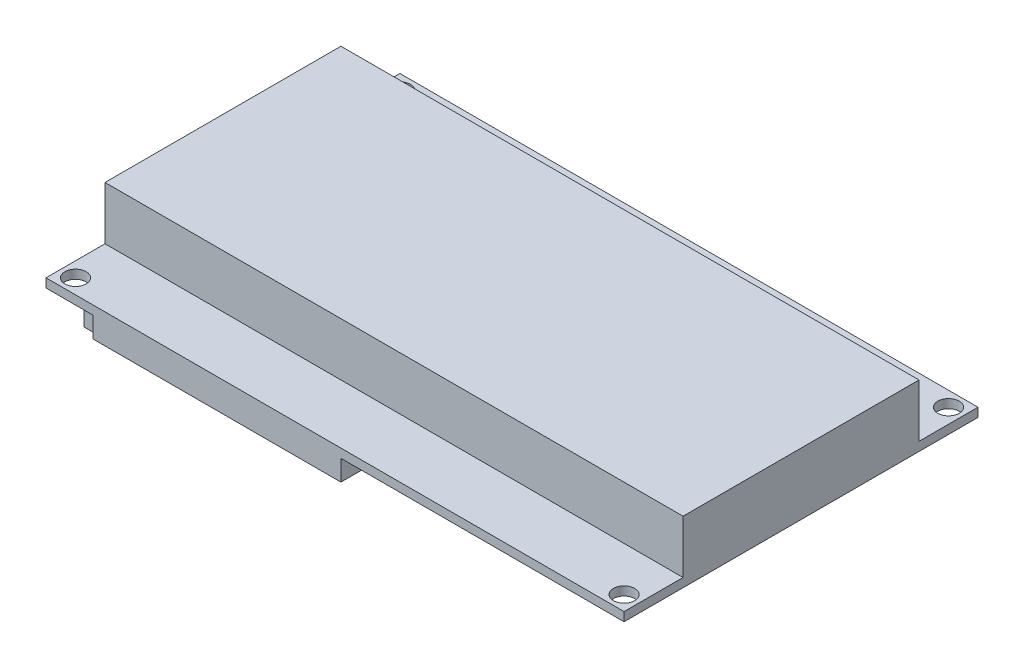
ISO-10303-21;
HEADER;
FILE_DESCRIPTION(('STEP AP214'),'2;1');
FILE_NAME('part.step','',(''),(''),'','','');
FILE_SCHEMA(('AUTOMOTIVE_DESIGN { 1 0 10303 214 1 1 1 1 }'));
ENDSEC;
DATA;
#1=APPLICATION_CONTEXT('core data for automotive mechanical design processes');
#2=APPLICATION_PROTOCOL_DEFINITION('international standard','automotive_design',2000,#1);
#3=PRODUCT_CONTEXT('',#1,'mechanical');
#4=PRODUCT('Part','Part','',(#3));
#5=PRODUCT_RELATED_PRODUCT_CATEGORY('part','',(#4));
#6=PRODUCT_DEFINITION_FORMATION('','',#4);
#7=PRODUCT_DEFINITION_CONTEXT('part definition',#1,'design');
#8=PRODUCT_DEFINITION('design','',#6,#7);
#9=PRODUCT_DEFINITION_SHAPE('','',#8);
#10=(LENGTH_UNIT() NAMED_UNIT(*) SI_UNIT(.MILLI.,.METRE.));
#11=(NAMED_UNIT(*) PLANE_ANGLE_UNIT() SI_UNIT($,.RADIAN.));
#12=(NAMED_UNIT(*) SI_UNIT($,.STERADIAN.) SOLID_ANGLE_UNIT());
#13=UNCERTAINTY_MEASURE_WITH_UNIT(LENGTH_MEASURE(1.E-05),#10,'distance_accuracy_value','');
#14=(GEOMETRIC_REPRESENTATION_CONTEXT(3) GLOBAL_UNCERTAINTY_ASSIGNED_CONTEXT((#13)) GLOBAL_UNIT_ASSIGNED_CONTEXT((#10,
#11,#12)) REPRESENTATION_CONTEXT('',''));
#15=CARTESIAN_POINT('',(0.,0.,0.));
#16=DIRECTION('',(0.,0.,1.));
#17=DIRECTION('',(1.,0.,0.));
#18=AXIS2_PLACEMENT_3D('',#15,#16,#17);
#19=CARTESIAN_POINT('',(0.,-3.5,0.));
#20=DIRECTION('',(0.,-1.,0.));
#21=DIRECTION('',(0.,0.,-1.));
#22=AXIS2_PLACEMENT_3D('',#19,#20,#21);
#23=PLANE('',#22);
#24=DIRECTION('',(1.,0.,0.));
#25=VECTOR('',#24,1.);
#26=CARTESIAN_POINT('',(-31.1622903908173,-3.5,12.3796659761304));
#27=LINE('',#26,#25);
#28=CARTESIAN_POINT('',(-31.1622903908173,-3.5,12.3796659761304));
#29=VERTEX_POINT('',#28);
#30=CARTESIAN_POINT('',(-25.9601784616069,-3.5,12.3796659761304));
#31=VERTEX_POINT('',#30);
#32=EDGE_CURVE('E313',#29,#31,#27,.T.);
#33=ORIENTED_EDGE('',*,*,#32,.F.);
#34=DIRECTION('',(0.,0.,-1.));
#35=VECTOR('',#34,1.);
#36=CARTESIAN_POINT('',(-31.1622903908173,-3.5,17.7206240939256));
#37=LINE('',#36,#35);
#38=CARTESIAN_POINT('',(-31.1622903908173,-3.5,17.7206240939256));
#39=VERTEX_POINT('',#38);
#40=EDGE_CURVE('E297',#39,#29,#37,.T.);
#41=ORIENTED_EDGE('',*,*,#40,.F.);
#42=DIRECTION('',(-1.,0.,0.));
#43=VECTOR('',#42,1.);
#44=CARTESIAN_POINT('',(-31.1622903908173,-3.5,17.7206240939256));
#45=LINE('',#44,#43);
#46=CARTESIAN_POINT('',(-25.9601784616069,-3.5,17.7206240939256));
#47=VERTEX_POINT('',#46);
#48=EDGE_CURVE('E304',#47,#39,#45,.T.);
#49=ORIENTED_EDGE('',*,*,#48,.F.);
#50=DIRECTION('',(0.,0.,1.));
#51=VECTOR('',#50,1.);
#52=CARTESIAN_POINT('',(-25.9601784616069,-3.5,17.7206240939256));
#53=LINE('',#52,#51);
#54=EDGE_CURVE('E317',#31,#47,#53,.T.);
#55=ORIENTED_EDGE('',*,*,#54,.F.);
#56=EDGE_LOOP('',(#33,#41,#49,#55));
#57=FACE_BOUND('',#56,.T.);
#58=DIRECTION('',(-1.,0.,0.));
#59=VECTOR('',#58,1.);
#60=CARTESIAN_POINT('',(-14.9200792291282,-3.5,24.751400220321));
#61=LINE('',#60,#59);
#62=CARTESIAN_POINT('',(-14.9200792291282,-3.5,24.751400220321));
#63=VERTEX_POINT('',#62);
#64=CARTESIAN_POINT('',(-20.8123605335331,-3.5,24.751400220321));
#65=VERTEX_POINT('',#64);
#66=EDGE_CURVE('E266',#63,#65,#61,.T.);
#67=ORIENTED_EDGE('',*,*,#66,.F.);
#68=DIRECTION('',(0.,0.,1.));
#69=VECTOR('',#68,1.);
#70=CARTESIAN_POINT('',(-14.9200792291282,-3.5,14.848599779679));
#71=LINE('',#70,#69);
#72=CARTESIAN_POINT('',(-14.9200792291282,-3.5,14.848599779679));
#73=VERTEX_POINT('',#72);
#74=EDGE_CURVE('E267',#73,#63,#71,.T.);
#75=ORIENTED_EDGE('',*,*,#74,.F.);
#76=DIRECTION('',(1.,0.,0.));
#77=VECTOR('',#76,1.);
#78=CARTESIAN_POINT('',(-14.9200792291282,-3.5,14.848599779679));
#79=LINE('',#78,#77);
#80=CARTESIAN_POINT('',(-20.8123605335331,-3.5,14.848599779679));
#81=VERTEX_POINT('',#80);
#82=EDGE_CURVE('E278',#81,#73,#79,.T.);
#83=ORIENTED_EDGE('',*,*,#82,.F.);
#84=DIRECTION('',(0.,0.,-1.));
#85=VECTOR('',#84,1.);
#86=CARTESIAN_POINT('',(-20.8123605335331,-3.5,14.848599779679));
#87=LINE('',#86,#85);
#88=EDGE_CURVE('E290',#65,#81,#87,.T.);
#89=ORIENTED_EDGE('',*,*,#88,.F.);
#90=EDGE_LOOP('',(#67,#75,#83,#89));
#91=FACE_BOUND('',#90,.T.);
#92=DIRECTION('',(0.,0.,1.));
#93=VECTOR('',#92,1.);
#94=CARTESIAN_POINT('',(1.,-3.5,30.));
#95=LINE('',#94,#93);
#96=CARTESIAN_POINT('',(1.,-3.5,9.59999999999999));
#97=VERTEX_POINT('',#96);
#98=CARTESIAN_POINT('',(1.,-3.5,15.));
#99=VERTEX_POINT('',#98);
#100=EDGE_CURVE('E368',#97,#99,#95,.T.);
#101=ORIENTED_EDGE('',*,*,#100,.T.);
#102=DIRECTION('',(1.,0.,0.));
#103=VECTOR('',#102,1.);
#104=CARTESIAN_POINT('',(-1.5,-3.5,15.));
#105=LINE('',#104,#103);
#106=CARTESIAN_POINT('',(-1.5,-3.5,15.));
#107=VERTEX_POINT('',#106);
#108=EDGE_CURVE('E62',#107,#99,#105,.T.);
#109=ORIENTED_EDGE('',*,*,#108,.F.);
#110=DIRECTION('',(0.,0.,-1.));
#111=VECTOR('',#110,1.);
#112=CARTESIAN_POINT('',(-1.5,-3.5,19.8));
#113=LINE('',#112,#111);
#114=CARTESIAN_POINT('',(-1.5,-3.5,19.8));
#115=VERTEX_POINT('',#114);
#116=EDGE_CURVE('E70',#115,#107,#113,.T.);
#117=ORIENTED_EDGE('',*,*,#116,.F.);
#118=DIRECTION('',(-1.,0.,0.));
#119=VECTOR('',#118,1.);
#120=CARTESIAN_POINT('',(-1.5,-3.5,19.8));
#121=LINE('',#120,#119);
#122=CARTESIAN_POINT('',(1.,-3.5,19.8));
#123=VERTEX_POINT('',#122);
#124=EDGE_CURVE('E527',#123,#115,#121,.T.);
#125=ORIENTED_EDGE('',*,*,#124,.F.);
#126=CARTESIAN_POINT('',(1.,-3.5,30.));
#127=VERTEX_POINT('',#126);
#128=EDGE_CURVE('E370',#123,#127,#95,.T.);
#129=ORIENTED_EDGE('',*,*,#128,.T.);
#130=DIRECTION('',(-1.,0.,0.));
#131=VECTOR('',#130,1.);
#132=CARTESIAN_POINT('',(-41.,-3.5,30.));
#133=LINE('',#132,#131);
#134=CARTESIAN_POINT('',(-41.,-3.5,30.));
#135=VERTEX_POINT('',#134);
#136=EDGE_CURVE('E369',#127,#135,#133,.T.);
#137=ORIENTED_EDGE('',*,*,#136,.T.);
#138=DIRECTION('',(0.,0.,-1.));
#139=VECTOR('',#138,1.);
#140=CARTESIAN_POINT('',(-41.,-3.5,30.));
#141=LINE('',#140,#139);
#142=CARTESIAN_POINT('',(-41.,-3.5,24.8));
#143=VERTEX_POINT('',#142);
#144=EDGE_CURVE('E363',#135,#143,#141,.T.);
#145=ORIENTED_EDGE('',*,*,#144,.T.);
#146=DIRECTION('',(-1.,0.,0.));
#147=VECTOR('',#146,1.);
#148=CARTESIAN_POINT('',(-38.5,-3.5,24.8));
#149=LINE('',#148,#147);
#150=CARTESIAN_POINT('',(-38.5,-3.5,24.8));
#151=VERTEX_POINT('',#150);
#152=EDGE_CURVE('E344',#151,#143,#149,.T.);
#153=ORIENTED_EDGE('',*,*,#152,.F.);
#154=DIRECTION('',(0.,0.,1.));
#155=VECTOR('',#154,1.);
#156=CARTESIAN_POINT('',(-38.5,-3.5,24.8));
#157=LINE('',#156,#155);
#158=CARTESIAN_POINT('',(-38.5,-3.5,14.8));
#159=VERTEX_POINT('',#158);
#160=EDGE_CURVE('E326',#159,#151,#157,.T.);
#161=ORIENTED_EDGE('',*,*,#160,.F.);
#162=DIRECTION('',(1.,0.,0.));
#163=VECTOR('',#162,1.);
#164=CARTESIAN_POINT('',(-38.5,-3.5,14.8));
#165=LINE('',#164,#163);
#166=CARTESIAN_POINT('',(-41.,-3.5,14.8));
#167=VERTEX_POINT('',#166);
#168=EDGE_CURVE('E11',#167,#159,#165,.T.);
#169=ORIENTED_EDGE('',*,*,#168,.F.);
#170=CARTESIAN_POINT('',(-41.,-3.5,9.59999999999999));
#171=VERTEX_POINT('',#170);
#172=EDGE_CURVE('E362',#167,#171,#141,.T.);
#173=ORIENTED_EDGE('',*,*,#172,.T.);
#174=DIRECTION('',(1.,0.,0.));
#175=VECTOR('',#174,1.);
#176=CARTESIAN_POINT('',(-41.,-3.5,9.59999999999999));
#177=LINE('',#176,#175);
#178=EDGE_CURVE('E361',#171,#97,#177,.T.);
#179=ORIENTED_EDGE('',*,*,#178,.T.);
#180=EDGE_LOOP('',(#101,#109,#117,#125,#129,#137,#145,#153,#161,#169,#173,#179));
#181=FACE_BOUND('',#180,.T.);
#182=ADVANCED_FACE('F44',(#57,#91,#181),#23,.T.);
#183=CARTESIAN_POINT('',(0.,1.5,0.));
#184=DIRECTION('',(0.,-1.,0.));
#185=DIRECTION('',(0.,0.,-1.));
#186=AXIS2_PLACEMENT_3D('',#183,#184,#185);
#187=PLANE('',#186);
#188=CARTESIAN_POINT('',(-46.5,1.5,27.5));
#189=DIRECTION('',(0.,-1.,0.));
#190=DIRECTION('',(0.,0.,-1.));
#191=AXIS2_PLACEMENT_3D('',#188,#189,#190);
#192=CIRCLE('',#191,1.8);
#193=CARTESIAN_POINT('',(-46.5,1.5,25.7));
#194=VERTEX_POINT('',#193);
#195=EDGE_CURVE('E460',#194,#194,#192,.T.);
#196=ORIENTED_EDGE('',*,*,#195,.T.);
#197=EDGE_LOOP('',(#196));
#198=FACE_BOUND('',#197,.T.);
#199=DIRECTION('',(1.,0.,0.));
#200=VECTOR('',#199,1.);
#201=CARTESIAN_POINT('',(0.,1.5,20.));
#202=LINE('',#201,#200);
#203=CARTESIAN_POINT('',(-49.,1.5,20.));
#204=VERTEX_POINT('',#203);
#205=CARTESIAN_POINT('',(49.,1.5,20.));
#206=VERTEX_POINT('',#205);
#207=EDGE_CURVE('E458',#204,#206,#202,.T.);
#208=ORIENTED_EDGE('',*,*,#207,.F.);
#209=DIRECTION('',(0.,0.,1.));
#210=VECTOR('',#209,1.);
#211=CARTESIAN_POINT('',(-49.,1.5,0.));
#212=LINE('',#211,#210);
#213=CARTESIAN_POINT('',(-49.,1.5,30.));
#214=VERTEX_POINT('',#213);
#215=EDGE_CURVE('E468',#204,#214,#212,.T.);
#216=ORIENTED_EDGE('',*,*,#215,.T.);
#217=DIRECTION('',(1.,0.,0.));
#218=VECTOR('',#217,1.);
#219=CARTESIAN_POINT('',(0.,1.5,30.));
#220=LINE('',#219,#218);
#221=CARTESIAN_POINT('',(49.,1.5,30.));
#222=VERTEX_POINT('',#221);
#223=EDGE_CURVE('E472',#214,#222,#220,.T.);
#224=ORIENTED_EDGE('',*,*,#223,.T.);
#225=DIRECTION('',(0.,0.,1.));
#226=VECTOR('',#225,1.);
#227=CARTESIAN_POINT('',(49.,1.5,0.));
#228=LINE('',#227,#226);
#229=EDGE_CURVE('E447',#206,#222,#228,.T.);
#230=ORIENTED_EDGE('',*,*,#229,.F.);
#231=EDGE_LOOP('',(#208,#216,#224,#230));
#232=FACE_BOUND('',#231,.T.);
#233=CARTESIAN_POINT('',(46.5,1.5,27.5));
#234=DIRECTION('',(0.,1.,0.));
#235=DIRECTION('',(0.,0.,-1.));
#236=AXIS2_PLACEMENT_3D('',#233,#234,#235);
#237=CIRCLE('',#236,1.8);
#238=CARTESIAN_POINT('',(46.5,1.5,25.7));
#239=VERTEX_POINT('',#238);
#240=EDGE_CURVE('E436',#239,#239,#237,.T.);
#241=ORIENTED_EDGE('',*,*,#240,.F.);
#242=EDGE_LOOP('',(#241));
#243=FACE_BOUND('',#242,.T.);
#244=ADVANCED_FACE('F517',(#198,#232,#243),#187,.F.);
#245=CARTESIAN_POINT('',(-49.,1.5,0.));
#246=DIRECTION('',(1.,0.,0.));
#247=DIRECTION('',(0.,0.,-1.));
#248=AXIS2_PLACEMENT_3D('',#245,#246,#247);
#249=PLANE('',#248);
#250=DIRECTION('',(0.,0.,1.));
#251=VECTOR('',#250,1.);
#252=CARTESIAN_POINT('',(-49.,0.,0.));
#253=LINE('',#252,#251);
#254=CARTESIAN_POINT('',(-49.,0.,-30.));
#255=VERTEX_POINT('',#254);
#256=CARTESIAN_POINT('',(-49.,0.,30.));
#257=VERTEX_POINT('',#256);
#258=EDGE_CURVE('E469',#255,#257,#253,.T.);
#259=ORIENTED_EDGE('',*,*,#258,.T.);
#260=DIRECTION('',(0.,-1.,0.));
#261=VECTOR('',#260,1.);
#262=CARTESIAN_POINT('',(-49.,1.5,30.));
#263=LINE('',#262,#261);
#264=EDGE_CURVE('E47',#214,#257,#263,.T.);
#265=ORIENTED_EDGE('',*,*,#264,.F.);
#266=ORIENTED_EDGE('',*,*,#215,.F.);
#267=DIRECTION('',(0.,-1.,0.));
#268=VECTOR('',#267,1.);
#269=CARTESIAN_POINT('',(-49.,10.5,20.));
#270=LINE('',#269,#268);
#271=CARTESIAN_POINT('',(-49.,10.5,20.));
#272=VERTEX_POINT('',#271);
#273=EDGE_CURVE('E463',#272,#204,#270,.T.);
#274=ORIENTED_EDGE('',*,*,#273,.F.);
#275=DIRECTION('',(0.,0.,1.));
#276=VECTOR('',#275,1.);
#277=CARTESIAN_POINT('',(-49.,10.5,0.));
#278=LINE('',#277,#276);
#279=CARTESIAN_POINT('',(-49.,10.5,-20.));
#280=VERTEX_POINT('',#279);
#281=EDGE_CURVE('E462',#280,#272,#278,.T.);
#282=ORIENTED_EDGE('',*,*,#281,.F.);
#283=DIRECTION('',(0.,-1.,0.));
#284=VECTOR('',#283,1.);
#285=CARTESIAN_POINT('',(-49.,10.5,-20.));
#286=LINE('',#285,#284);
#287=CARTESIAN_POINT('',(-49.,1.5,-20.));
#288=VERTEX_POINT('',#287);
#289=EDGE_CURVE('E420',#280,#288,#286,.T.);
#290=ORIENTED_EDGE('',*,*,#289,.T.);
#291=DIRECTION('',(0.,0.,-1.));
#292=VECTOR('',#291,1.);
#293=CARTESIAN_POINT('',(-49.,1.5,0.));
#294=LINE('',#293,#292);
#295=CARTESIAN_POINT('',(-49.,1.5,-30.));
#296=VERTEX_POINT('',#295);
#297=EDGE_CURVE('E422',#288,#296,#294,.T.);
#298=ORIENTED_EDGE('',*,*,#297,.T.);
#299=DIRECTION('',(0.,-1.,0.));
#300=VECTOR('',#299,1.);
#301=CARTESIAN_POINT('',(-49.,1.5,-30.));
#302=LINE('',#301,#300);
#303=EDGE_CURVE('E426',#296,#255,#302,.T.);
#304=ORIENTED_EDGE('',*,*,#303,.T.);
#305=EDGE_LOOP('',(#259,#265,#266,#274,#282,#290,#298,#304));
#306=FACE_BOUND('',#305,.T.);
#307=ADVANCED_FACE('F50',(#306),#249,.F.);
#308=CARTESIAN_POINT('',(0.,1.5,30.));
#309=DIRECTION('',(0.,0.,-1.));
#310=DIRECTION('',(-1.,0.,0.));
#311=AXIS2_PLACEMENT_3D('',#308,#309,#310);
#312=PLANE('',#311);
#313=DIRECTION('',(1.,0.,0.));
#314=VECTOR('',#313,1.);
#315=CARTESIAN_POINT('',(0.,0.,30.));
#316=LINE('',#315,#314);
#317=CARTESIAN_POINT('',(-41.,0.,30.));
#318=VERTEX_POINT('',#317);
#319=EDGE_CURVE('E474',#257,#318,#316,.T.);
#320=ORIENTED_EDGE('',*,*,#319,.T.);
#321=DIRECTION('',(0.,1.,0.));
#322=VECTOR('',#321,1.);
#323=CARTESIAN_POINT('',(-41.,-3.5,30.));
#324=LINE('',#323,#322);
#325=EDGE_CURVE('E373',#135,#318,#324,.T.);
#326=ORIENTED_EDGE('',*,*,#325,.F.);
#327=ORIENTED_EDGE('',*,*,#136,.F.);
#328=DIRECTION('',(0.,1.,0.));
#329=VECTOR('',#328,1.);
#330=CARTESIAN_POINT('',(1.,-3.5,30.));
#331=LINE('',#330,#329);
#332=CARTESIAN_POINT('',(1.,0.,30.));
#333=VERTEX_POINT('',#332);
#334=EDGE_CURVE('E381',#127,#333,#331,.T.);
#335=ORIENTED_EDGE('',*,*,#334,.T.);
#336=CARTESIAN_POINT('',(49.,0.,30.));
#337=VERTEX_POINT('',#336);
#338=EDGE_CURVE('E475',#333,#337,#316,.T.);
#339=ORIENTED_EDGE('',*,*,#338,.T.);
#340=DIRECTION('',(0.,-1.,0.));
#341=VECTOR('',#340,1.);
#342=CARTESIAN_POINT('',(49.,1.5,30.));
#343=LINE('',#342,#341);
#344=EDGE_CURVE('E446',#222,#337,#343,.T.);
#345=ORIENTED_EDGE('',*,*,#344,.F.);
#346=ORIENTED_EDGE('',*,*,#223,.F.);
#347=ORIENTED_EDGE('',*,*,#264,.T.);
#348=EDGE_LOOP('',(#320,#326,#327,#335,#339,#345,#346,#347));
#349=FACE_BOUND('',#348,.T.);
#350=ADVANCED_FACE('F485',(#349),#312,.F.);
#351=CARTESIAN_POINT('',(0.,0.,0.));
#352=DIRECTION('',(0.,-1.,0.));
#353=DIRECTION('',(0.,0.,-1.));
#354=AXIS2_PLACEMENT_3D('',#351,#352,#353);
#355=PLANE('',#354);
#356=DIRECTION('',(0.,0.,-1.));
#357=VECTOR('',#356,1.);
#358=CARTESIAN_POINT('',(-41.,0.,30.));
#359=LINE('',#358,#357);
#360=CARTESIAN_POINT('',(-41.,0.,9.59999999999999));
#361=VERTEX_POINT('',#360);
#362=EDGE_CURVE('E359',#318,#361,#359,.T.);
#363=ORIENTED_EDGE('',*,*,#362,.F.);
#364=ORIENTED_EDGE('',*,*,#319,.F.);
#365=ORIENTED_EDGE('',*,*,#258,.F.);
#366=DIRECTION('',(1.,0.,0.));
#367=VECTOR('',#366,1.);
#368=CARTESIAN_POINT('',(0.,0.,-30.));
#369=LINE('',#368,#367);
#370=CARTESIAN_POINT('',(49.,0.,-30.));
#371=VERTEX_POINT('',#370);
#372=EDGE_CURVE('E423',#255,#371,#369,.T.);
#373=ORIENTED_EDGE('',*,*,#372,.T.);
#374=DIRECTION('',(0.,0.,1.));
#375=VECTOR('',#374,1.);
#376=CARTESIAN_POINT('',(49.,0.,0.));
#377=LINE('',#376,#375);
#378=EDGE_CURVE('E444',#371,#337,#377,.T.);
#379=ORIENTED_EDGE('',*,*,#378,.T.);
#380=ORIENTED_EDGE('',*,*,#338,.F.);
#381=DIRECTION('',(0.,0.,1.));
#382=VECTOR('',#381,1.);
#383=CARTESIAN_POINT('',(1.,0.,30.));
#384=LINE('',#383,#382);
#385=CARTESIAN_POINT('',(1.,0.,9.59999999999999));
#386=VERTEX_POINT('',#385);
#387=EDGE_CURVE('E378',#386,#333,#384,.T.);
#388=ORIENTED_EDGE('',*,*,#387,.F.);
#389=DIRECTION('',(1.,0.,0.));
#390=VECTOR('',#389,1.);
#391=CARTESIAN_POINT('',(-41.,0.,9.59999999999999));
#392=LINE('',#391,#390);
#393=EDGE_CURVE('E376',#361,#386,#392,.T.);
#394=ORIENTED_EDGE('',*,*,#393,.F.);
#395=EDGE_LOOP('',(#363,#364,#365,#373,#379,#380,#388,#394));
#396=FACE_BOUND('',#395,.T.);
#397=CARTESIAN_POINT('',(-46.5,0.,27.5));
#398=DIRECTION('',(0.,1.,0.));
#399=DIRECTION('',(0.,0.,1.));
#400=AXIS2_PLACEMENT_3D('',#397,#398,#399);
#401=CIRCLE('',#400,1.8);
#402=CARTESIAN_POINT('',(-46.5,0.,29.3));
#403=VERTEX_POINT('',#402);
#404=EDGE_CURVE('E453',#403,#403,#401,.T.);
#405=ORIENTED_EDGE('',*,*,#404,.T.);
#406=EDGE_LOOP('',(#405));
#407=FACE_BOUND('',#406,.T.);
#408=CARTESIAN_POINT('',(46.5,0.,27.5));
#409=DIRECTION('',(0.,-1.,0.));
#410=DIRECTION('',(0.,0.,1.));
#411=AXIS2_PLACEMENT_3D('',#408,#409,#410);
#412=CIRCLE('',#411,1.8);
#413=CARTESIAN_POINT('',(46.5,0.,29.3));
#414=VERTEX_POINT('',#413);
#415=EDGE_CURVE('E433',#414,#414,#412,.T.);
#416=ORIENTED_EDGE('',*,*,#415,.F.);
#417=EDGE_LOOP('',(#416));
#418=FACE_BOUND('',#417,.T.);
#419=CARTESIAN_POINT('',(-46.5,0.,-27.5));
#420=DIRECTION('',(0.,-1.,0.));
#421=DIRECTION('',(0.,0.,-1.));
#422=AXIS2_PLACEMENT_3D('',#419,#420,#421);
#423=CIRCLE('',#422,1.8);
#424=CARTESIAN_POINT('',(-46.5,0.,-29.3));
#425=VERTEX_POINT('',#424);
#426=EDGE_CURVE('E407',#425,#425,#423,.T.);
#427=ORIENTED_EDGE('',*,*,#426,.F.);
#428=EDGE_LOOP('',(#427));
#429=FACE_BOUND('',#428,.T.);
#430=CARTESIAN_POINT('',(46.5,0.,-27.5));
#431=DIRECTION('',(0.,1.,0.));
#432=DIRECTION('',(0.,0.,-1.));
#433=AXIS2_PLACEMENT_3D('',#430,#431,#432);
#434=CIRCLE('',#433,1.8);
#435=CARTESIAN_POINT('',(46.5,0.,-29.3));
#436=VERTEX_POINT('',#435);
#437=EDGE_CURVE('E394',#436,#436,#434,.T.);
#438=ORIENTED_EDGE('',*,*,#437,.T.);
#439=EDGE_LOOP('',(#438));
#440=FACE_BOUND('',#439,.T.);
#441=ADVANCED_FACE('F489',(#396,#407,#418,#429,#440),#355,.T.);
#442=CARTESIAN_POINT('',(0.,10.5,20.));
#443=DIRECTION('',(0.,0.,-1.));
#444=DIRECTION('',(-1.,0.,0.));
#445=AXIS2_PLACEMENT_3D('',#442,#443,#444);
#446=PLANE('',#445);
#447=ORIENTED_EDGE('',*,*,#207,.T.);
#448=DIRECTION('',(0.,-1.,0.));
#449=VECTOR('',#448,1.);
#450=CARTESIAN_POINT('',(49.,10.5,20.));
#451=LINE('',#450,#449);
#452=CARTESIAN_POINT('',(49.,10.5,20.));
#453=VERTEX_POINT('',#452);
#454=EDGE_CURVE('E445',#453,#206,#451,.T.);
#455=ORIENTED_EDGE('',*,*,#454,.F.);
#456=DIRECTION('',(1.,0.,0.));
#457=VECTOR('',#456,1.);
#458=CARTESIAN_POINT('',(0.,10.5,20.));
#459=LINE('',#458,#457);
#460=EDGE_CURVE('E464',#272,#453,#459,.T.);
#461=ORIENTED_EDGE('',*,*,#460,.F.);
#462=ORIENTED_EDGE('',*,*,#273,.T.);
#463=EDGE_LOOP('',(#447,#455,#461,#462));
#464=FACE_BOUND('',#463,.T.);
#465=ADVANCED_FACE('F513',(#464),#446,.F.);
#466=CARTESIAN_POINT('',(0.,10.5,0.));
#467=DIRECTION('',(0.,-1.,0.));
#468=DIRECTION('',(0.,0.,-1.));
#469=AXIS2_PLACEMENT_3D('',#466,#467,#468);
#470=PLANE('',#469);
#471=ORIENTED_EDGE('',*,*,#460,.T.);
#472=DIRECTION('',(0.,0.,1.));
#473=VECTOR('',#472,1.);
#474=CARTESIAN_POINT('',(49.,10.5,0.));
#475=LINE('',#474,#473);
#476=CARTESIAN_POINT('',(49.,10.5,-20.));
#477=VERTEX_POINT('',#476);
#478=EDGE_CURVE('E437',#477,#453,#475,.T.);
#479=ORIENTED_EDGE('',*,*,#478,.F.);
#480=DIRECTION('',(1.,0.,0.));
#481=VECTOR('',#480,1.);
#482=CARTESIAN_POINT('',(0.,10.5,-20.));
#483=LINE('',#482,#481);
#484=EDGE_CURVE('E411',#280,#477,#483,.T.);
#485=ORIENTED_EDGE('',*,*,#484,.F.);
#486=ORIENTED_EDGE('',*,*,#281,.T.);
#487=EDGE_LOOP('',(#471,#479,#485,#486));
#488=FACE_BOUND('',#487,.T.);
#489=ADVANCED_FACE('F509',(#488),#470,.F.);
#490=CARTESIAN_POINT('',(-46.5,0.,27.5));
#491=DIRECTION('',(0.,1.,0.));
#492=DIRECTION('',(0.,0.,1.));
#493=AXIS2_PLACEMENT_3D('',#490,#491,#492);
#494=CYLINDRICAL_SURFACE('',#493,1.8);
#495=ORIENTED_EDGE('',*,*,#404,.F.);
#496=EDGE_LOOP('',(#495));
#497=FACE_BOUND('',#496,.T.);
#498=ORIENTED_EDGE('',*,*,#195,.F.);
#499=EDGE_LOOP('',(#498));
#500=FACE_BOUND('',#499,.T.);
#501=ADVANCED_FACE('F606',(#497,#500),#494,.F.);
#502=CARTESIAN_POINT('',(49.,1.5,0.));
#503=DIRECTION('',(-1.,0.,0.));
#504=DIRECTION('',(0.,0.,-1.));
#505=AXIS2_PLACEMENT_3D('',#502,#503,#504);
#506=PLANE('',#505);
#507=ORIENTED_EDGE('',*,*,#378,.F.);
#508=DIRECTION('',(0.,-1.,0.));
#509=VECTOR('',#508,1.);
#510=CARTESIAN_POINT('',(49.,1.5,-30.));
#511=LINE('',#510,#509);
#512=CARTESIAN_POINT('',(49.,1.5,-30.));
#513=VERTEX_POINT('',#512);
#514=EDGE_CURVE('E404',#513,#371,#511,.T.);
#515=ORIENTED_EDGE('',*,*,#514,.F.);
#516=DIRECTION('',(0.,0.,-1.));
#517=VECTOR('',#516,1.);
#518=CARTESIAN_POINT('',(49.,1.5,0.));
#519=LINE('',#518,#517);
#520=CARTESIAN_POINT('',(49.,1.5,-20.));
#521=VERTEX_POINT('',#520);
#522=EDGE_CURVE('E402',#521,#513,#519,.T.);
#523=ORIENTED_EDGE('',*,*,#522,.F.);
#524=DIRECTION('',(0.,-1.,0.));
#525=VECTOR('',#524,1.);
#526=CARTESIAN_POINT('',(49.,10.5,-20.));
#527=LINE('',#526,#525);
#528=EDGE_CURVE('E396',#477,#521,#527,.T.);
#529=ORIENTED_EDGE('',*,*,#528,.F.);
#530=ORIENTED_EDGE('',*,*,#478,.T.);
#531=ORIENTED_EDGE('',*,*,#454,.T.);
#532=ORIENTED_EDGE('',*,*,#229,.T.);
#533=ORIENTED_EDGE('',*,*,#344,.T.);
#534=EDGE_LOOP('',(#507,#515,#523,#529,#530,#531,#532,#533));
#535=FACE_BOUND('',#534,.T.);
#536=ADVANCED_FACE('F486',(#535),#506,.F.);
#537=CARTESIAN_POINT('',(46.5,0.,27.5));
#538=DIRECTION('',(0.,1.,0.));
#539=DIRECTION('',(0.,0.,1.));
#540=AXIS2_PLACEMENT_3D('',#537,#538,#539);
#541=CYLINDRICAL_SURFACE('',#540,1.8);
#542=ORIENTED_EDGE('',*,*,#415,.T.);
#543=EDGE_LOOP('',(#542));
#544=FACE_BOUND('',#543,.T.);
#545=ORIENTED_EDGE('',*,*,#240,.T.);
#546=EDGE_LOOP('',(#545));
#547=FACE_BOUND('',#546,.T.);
#548=ADVANCED_FACE('F598',(#544,#547),#541,.F.);
#549=CARTESIAN_POINT('',(0.,1.5,0.));
#550=DIRECTION('',(0.,-1.,0.));
#551=DIRECTION('',(0.,0.,1.));
#552=AXIS2_PLACEMENT_3D('',#549,#550,#551);
#553=PLANE('',#552);
#554=CARTESIAN_POINT('',(-46.5,1.5,-27.5));
#555=DIRECTION('',(0.,1.,0.));
#556=DIRECTION('',(0.,0.,1.));
#557=AXIS2_PLACEMENT_3D('',#554,#555,#556);
#558=CIRCLE('',#557,1.8);
#559=CARTESIAN_POINT('',(-46.5,1.5,-25.7));
#560=VERTEX_POINT('',#559);
#561=EDGE_CURVE('E410',#560,#560,#558,.T.);
#562=ORIENTED_EDGE('',*,*,#561,.F.);
#563=EDGE_LOOP('',(#562));
#564=FACE_BOUND('',#563,.T.);
#565=DIRECTION('',(1.,0.,0.));
#566=VECTOR('',#565,1.);
#567=CARTESIAN_POINT('',(0.,1.5,-20.));
#568=LINE('',#567,#566);
#569=EDGE_CURVE('E414',#288,#521,#568,.T.);
#570=ORIENTED_EDGE('',*,*,#569,.T.);
#571=ORIENTED_EDGE('',*,*,#522,.T.);
#572=DIRECTION('',(1.,0.,0.));
#573=VECTOR('',#572,1.);
#574=CARTESIAN_POINT('',(0.,1.5,-30.));
#575=LINE('',#574,#573);
#576=EDGE_CURVE('E424',#296,#513,#575,.T.);
#577=ORIENTED_EDGE('',*,*,#576,.F.);
#578=ORIENTED_EDGE('',*,*,#297,.F.);
#579=EDGE_LOOP('',(#570,#571,#577,#578));
#580=FACE_BOUND('',#579,.T.);
#581=CARTESIAN_POINT('',(46.5,1.5,-27.5));
#582=DIRECTION('',(0.,-1.,0.));
#583=DIRECTION('',(0.,0.,1.));
#584=AXIS2_PLACEMENT_3D('',#581,#582,#583);
#585=CIRCLE('',#584,1.8);
#586=CARTESIAN_POINT('',(46.5,1.5,-25.7));
#587=VERTEX_POINT('',#586);
#588=EDGE_CURVE('E397',#587,#587,#585,.T.);
#589=ORIENTED_EDGE('',*,*,#588,.T.);
#590=EDGE_LOOP('',(#589));
#591=FACE_BOUND('',#590,.T.);
#592=ADVANCED_FACE('F505',(#564,#580,#591),#553,.F.);
#593=CARTESIAN_POINT('',(0.,1.5,-30.));
#594=DIRECTION('',(0.,0.,1.));
#595=DIRECTION('',(-1.,0.,0.));
#596=AXIS2_PLACEMENT_3D('',#593,#594,#595);
#597=PLANE('',#596);
#598=ORIENTED_EDGE('',*,*,#372,.F.);
#599=ORIENTED_EDGE('',*,*,#303,.F.);
#600=ORIENTED_EDGE('',*,*,#576,.T.);
#601=ORIENTED_EDGE('',*,*,#514,.T.);
#602=EDGE_LOOP('',(#598,#599,#600,#601));
#603=FACE_BOUND('',#602,.T.);
#604=ADVANCED_FACE('F494',(#603),#597,.F.);
#605=CARTESIAN_POINT('',(0.,10.5,-20.));
#606=DIRECTION('',(0.,0.,1.));
#607=DIRECTION('',(-1.,0.,0.));
#608=AXIS2_PLACEMENT_3D('',#605,#606,#607);
#609=PLANE('',#608);
#610=ORIENTED_EDGE('',*,*,#569,.F.);
#611=ORIENTED_EDGE('',*,*,#289,.F.);
#612=ORIENTED_EDGE('',*,*,#484,.T.);
#613=ORIENTED_EDGE('',*,*,#528,.T.);
#614=EDGE_LOOP('',(#610,#611,#612,#613));
#615=FACE_BOUND('',#614,.T.);
#616=ADVANCED_FACE('F507',(#615),#609,.F.);
#617=CARTESIAN_POINT('',(-46.5,0.,-27.5));
#618=DIRECTION('',(0.,1.,0.));
#619=DIRECTION('',(0.,0.,-1.));
#620=AXIS2_PLACEMENT_3D('',#617,#618,#619);
#621=CYLINDRICAL_SURFACE('',#620,1.8);
#622=ORIENTED_EDGE('',*,*,#426,.T.);
#623=EDGE_LOOP('',(#622));
#624=FACE_BOUND('',#623,.T.);
#625=ORIENTED_EDGE('',*,*,#561,.T.);
#626=EDGE_LOOP('',(#625));
#627=FACE_BOUND('',#626,.T.);
#628=ADVANCED_FACE('F592',(#624,#627),#621,.F.);
#629=CARTESIAN_POINT('',(46.5,0.,-27.5));
#630=DIRECTION('',(0.,1.,0.));
#631=DIRECTION('',(0.,0.,-1.));
#632=AXIS2_PLACEMENT_3D('',#629,#630,#631);
#633=CYLINDRICAL_SURFACE('',#632,1.8);
#634=ORIENTED_EDGE('',*,*,#437,.F.);
#635=EDGE_LOOP('',(#634));
#636=FACE_BOUND('',#635,.T.);
#637=ORIENTED_EDGE('',*,*,#588,.F.);
#638=EDGE_LOOP('',(#637));
#639=FACE_BOUND('',#638,.T.);
#640=ADVANCED_FACE('F589',(#636,#639),#633,.F.);
#641=CARTESIAN_POINT('',(-41.,-3.5,30.));
#642=DIRECTION('',(1.,0.,0.));
#643=DIRECTION('',(0.,0.,-1.));
#644=AXIS2_PLACEMENT_3D('',#641,#642,#643);
#645=PLANE('',#644);
#646=ORIENTED_EDGE('',*,*,#362,.T.);
#647=DIRECTION('',(0.,1.,0.));
#648=VECTOR('',#647,1.);
#649=CARTESIAN_POINT('',(-41.,-3.5,9.59999999999999));
#650=LINE('',#649,#648);
#651=EDGE_CURVE('E390',#171,#361,#650,.T.);
#652=ORIENTED_EDGE('',*,*,#651,.F.);
#653=ORIENTED_EDGE('',*,*,#172,.F.);
#654=EDGE_CURVE('E364',#143,#167,#141,.T.);
#655=ORIENTED_EDGE('',*,*,#654,.F.);
#656=ORIENTED_EDGE('',*,*,#144,.F.);
#657=ORIENTED_EDGE('',*,*,#325,.T.);
#658=EDGE_LOOP('',(#646,#652,#653,#655,#656,#657));
#659=FACE_BOUND('',#658,.T.);
#660=ADVANCED_FACE('F525',(#659),#645,.F.);
#661=CARTESIAN_POINT('',(-41.,-3.5,9.59999999999999));
#662=DIRECTION('',(0.,0.,1.));
#663=DIRECTION('',(1.,0.,0.));
#664=AXIS2_PLACEMENT_3D('',#661,#662,#663);
#665=PLANE('',#664);
#666=ORIENTED_EDGE('',*,*,#393,.T.);
#667=DIRECTION('',(0.,1.,0.));
#668=VECTOR('',#667,1.);
#669=CARTESIAN_POINT('',(1.,-3.5,9.59999999999999));
#670=LINE('',#669,#668);
#671=EDGE_CURVE('E387',#97,#386,#670,.T.);
#672=ORIENTED_EDGE('',*,*,#671,.F.);
#673=ORIENTED_EDGE('',*,*,#178,.F.);
#674=ORIENTED_EDGE('',*,*,#651,.T.);
#675=EDGE_LOOP('',(#666,#672,#673,#674));
#676=FACE_BOUND('',#675,.T.);
#677=ADVANCED_FACE('F531',(#676),#665,.F.);
#678=CARTESIAN_POINT('',(1.,-3.5,30.));
#679=DIRECTION('',(-1.,0.,0.));
#680=DIRECTION('',(0.,0.,1.));
#681=AXIS2_PLACEMENT_3D('',#678,#679,#680);
#682=PLANE('',#681);
#683=ORIENTED_EDGE('',*,*,#387,.T.);
#684=ORIENTED_EDGE('',*,*,#334,.F.);
#685=ORIENTED_EDGE('',*,*,#128,.F.);
#686=EDGE_CURVE('E371',#99,#123,#95,.T.);
#687=ORIENTED_EDGE('',*,*,#686,.F.);
#688=ORIENTED_EDGE('',*,*,#100,.F.);
#689=ORIENTED_EDGE('',*,*,#671,.T.);
#690=EDGE_LOOP('',(#683,#684,#685,#687,#688,#689));
#691=FACE_BOUND('',#690,.T.);
#692=ADVANCED_FACE('F526',(#691),#682,.F.);
#693=CARTESIAN_POINT('',(-38.5,-7.7,24.8));
#694=DIRECTION('',(-1.,0.,0.));
#695=DIRECTION('',(0.,0.,1.));
#696=AXIS2_PLACEMENT_3D('',#693,#694,#695);
#697=PLANE('',#696);
#698=ORIENTED_EDGE('',*,*,#160,.T.);
#699=DIRECTION('',(0.,1.,0.));
#700=VECTOR('',#699,1.);
#701=CARTESIAN_POINT('',(-38.5,-7.7,24.8));
#702=LINE('',#701,#700);
#703=CARTESIAN_POINT('',(-38.5,-7.7,24.8));
#704=VERTEX_POINT('',#703);
#705=EDGE_CURVE('E357',#704,#151,#702,.T.);
#706=ORIENTED_EDGE('',*,*,#705,.F.);
#707=DIRECTION('',(0.,0.,1.));
#708=VECTOR('',#707,1.);
#709=CARTESIAN_POINT('',(-38.5,-7.7,24.8));
#710=LINE('',#709,#708);
#711=CARTESIAN_POINT('',(-38.5,-7.7,14.8));
#712=VERTEX_POINT('',#711);
#713=EDGE_CURVE('E328',#712,#704,#710,.T.);
#714=ORIENTED_EDGE('',*,*,#713,.F.);
#715=DIRECTION('',(0.,1.,0.));
#716=VECTOR('',#715,1.);
#717=CARTESIAN_POINT('',(-38.5,-7.7,14.8));
#718=LINE('',#717,#716);
#719=EDGE_CURVE('E339',#712,#159,#718,.T.);
#720=ORIENTED_EDGE('',*,*,#719,.T.);
#721=EDGE_LOOP('',(#698,#706,#714,#720));
#722=FACE_BOUND('',#721,.T.);
#723=ADVANCED_FACE('F554',(#722),#697,.F.);
#724=CARTESIAN_POINT('',(-38.5,-7.7,24.8));
#725=DIRECTION('',(0.,0.,-1.));
#726=DIRECTION('',(-1.,0.,0.));
#727=AXIS2_PLACEMENT_3D('',#724,#725,#726);
#728=PLANE('',#727);
#729=ORIENTED_EDGE('',*,*,#152,.T.);
#730=CARTESIAN_POINT('',(-47.8,-3.5,24.8));
#731=VERTEX_POINT('',#730);
#732=EDGE_CURVE('E342',#143,#731,#149,.T.);
#733=ORIENTED_EDGE('',*,*,#732,.T.);
#734=DIRECTION('',(0.,1.,0.));
#735=VECTOR('',#734,1.);
#736=CARTESIAN_POINT('',(-47.8,-7.7,24.8));
#737=LINE('',#736,#735);
#738=CARTESIAN_POINT('',(-47.8,-7.7,24.8));
#739=VERTEX_POINT('',#738);
#740=EDGE_CURVE('E351',#739,#731,#737,.T.);
#741=ORIENTED_EDGE('',*,*,#740,.F.);
#742=DIRECTION('',(-1.,0.,0.));
#743=VECTOR('',#742,1.);
#744=CARTESIAN_POINT('',(-38.5,-7.7,24.8));
#745=LINE('',#744,#743);
#746=EDGE_CURVE('E334',#704,#739,#745,.T.);
#747=ORIENTED_EDGE('',*,*,#746,.F.);
#748=ORIENTED_EDGE('',*,*,#705,.T.);
#749=EDGE_LOOP('',(#729,#733,#741,#747,#748));
#750=FACE_BOUND('',#749,.T.);
#751=ADVANCED_FACE('F552',(#750),#728,.F.);
#752=CARTESIAN_POINT('',(-47.8,-7.7,24.8));
#753=DIRECTION('',(1.,0.,0.));
#754=DIRECTION('',(0.,0.,-1.));
#755=AXIS2_PLACEMENT_3D('',#752,#753,#754);
#756=PLANE('',#755);
#757=DIRECTION('',(0.,0.,-1.));
#758=VECTOR('',#757,1.);
#759=CARTESIAN_POINT('',(-47.8,-3.5,24.8));
#760=LINE('',#759,#758);
#761=CARTESIAN_POINT('',(-47.8,-3.5,14.8));
#762=VERTEX_POINT('',#761);
#763=EDGE_CURVE('E347',#731,#762,#760,.T.);
#764=ORIENTED_EDGE('',*,*,#763,.T.);
#765=DIRECTION('',(0.,1.,0.));
#766=VECTOR('',#765,1.);
#767=CARTESIAN_POINT('',(-47.8,-7.7,14.8));
#768=LINE('',#767,#766);
#769=CARTESIAN_POINT('',(-47.8,-7.7,14.8));
#770=VERTEX_POINT('',#769);
#771=EDGE_CURVE('E352',#770,#762,#768,.T.);
#772=ORIENTED_EDGE('',*,*,#771,.F.);
#773=DIRECTION('',(0.,0.,-1.));
#774=VECTOR('',#773,1.);
#775=CARTESIAN_POINT('',(-47.8,-7.7,24.8));
#776=LINE('',#775,#774);
#777=EDGE_CURVE('E333',#739,#770,#776,.T.);
#778=ORIENTED_EDGE('',*,*,#777,.F.);
#779=ORIENTED_EDGE('',*,*,#740,.T.);
#780=EDGE_LOOP('',(#764,#772,#778,#779));
#781=FACE_BOUND('',#780,.T.);
#782=ADVANCED_FACE('F546',(#781),#756,.F.);
#783=CARTESIAN_POINT('',(-38.5,-7.7,14.8));
#784=DIRECTION('',(0.,0.,1.));
#785=DIRECTION('',(1.,0.,0.));
#786=AXIS2_PLACEMENT_3D('',#783,#784,#785);
#787=PLANE('',#786);
#788=EDGE_CURVE('E54',#762,#167,#165,.T.);
#789=ORIENTED_EDGE('',*,*,#788,.T.);
#790=ORIENTED_EDGE('',*,*,#168,.T.);
#791=ORIENTED_EDGE('',*,*,#719,.F.);
#792=DIRECTION('',(1.,0.,0.));
#793=VECTOR('',#792,1.);
#794=CARTESIAN_POINT('',(-38.5,-7.7,14.8));
#795=LINE('',#794,#793);
#796=EDGE_CURVE('E340',#770,#712,#795,.T.);
#797=ORIENTED_EDGE('',*,*,#796,.F.);
#798=ORIENTED_EDGE('',*,*,#771,.T.);
#799=EDGE_LOOP('',(#789,#790,#791,#797,#798));
#800=FACE_BOUND('',#799,.T.);
#801=ADVANCED_FACE('F544',(#800),#787,.F.);
#802=CARTESIAN_POINT('',(0.,-7.7,0.));
#803=DIRECTION('',(0.,1.,0.));
#804=DIRECTION('',(0.,0.,1.));
#805=AXIS2_PLACEMENT_3D('',#802,#803,#804);
#806=PLANE('',#805);
#807=ORIENTED_EDGE('',*,*,#713,.T.);
#808=ORIENTED_EDGE('',*,*,#746,.T.);
#809=ORIENTED_EDGE('',*,*,#777,.T.);
#810=ORIENTED_EDGE('',*,*,#796,.T.);
#811=EDGE_LOOP('',(#807,#808,#809,#810));
#812=FACE_BOUND('',#811,.T.);
#813=ADVANCED_FACE('F556',(#812),#806,.F.);
#814=CARTESIAN_POINT('',(0.,-3.5,0.));
#815=DIRECTION('',(0.,1.,0.));
#816=DIRECTION('',(0.,0.,1.));
#817=AXIS2_PLACEMENT_3D('',#814,#815,#816);
#818=PLANE('',#817);
#819=ORIENTED_EDGE('',*,*,#732,.F.);
#820=ORIENTED_EDGE('',*,*,#654,.T.);
#821=ORIENTED_EDGE('',*,*,#788,.F.);
#822=ORIENTED_EDGE('',*,*,#763,.F.);
#823=EDGE_LOOP('',(#819,#820,#821,#822));
#824=FACE_BOUND('',#823,.T.);
#825=ADVANCED_FACE('F540',(#824),#818,.T.);
#826=CARTESIAN_POINT('',(-31.1622903908173,-7.7,17.7206240939256));
#827=DIRECTION('',(1.,0.,0.));
#828=DIRECTION('',(0.,0.,-1.));
#829=AXIS2_PLACEMENT_3D('',#826,#827,#828);
#830=PLANE('',#829);
#831=ORIENTED_EDGE('',*,*,#40,.T.);
#832=DIRECTION('',(0.,1.,0.));
#833=VECTOR('',#832,1.);
#834=CARTESIAN_POINT('',(-31.1622903908173,-7.7,12.3796659761304));
#835=LINE('',#834,#833);
#836=CARTESIAN_POINT('',(-31.1622903908173,-7.7,12.3796659761304));
#837=VERTEX_POINT('',#836);
#838=EDGE_CURVE('E330',#837,#29,#835,.T.);
#839=ORIENTED_EDGE('',*,*,#838,.F.);
#840=DIRECTION('',(0.,0.,-1.));
#841=VECTOR('',#840,1.);
#842=CARTESIAN_POINT('',(-31.1622903908173,-7.7,17.7206240939256));
#843=LINE('',#842,#841);
#844=CARTESIAN_POINT('',(-31.1622903908173,-7.7,17.7206240939256));
#845=VERTEX_POINT('',#844);
#846=EDGE_CURVE('E301',#845,#837,#843,.T.);
#847=ORIENTED_EDGE('',*,*,#846,.F.);
#848=DIRECTION('',(0.,1.,0.));
#849=VECTOR('',#848,1.);
#850=CARTESIAN_POINT('',(-31.1622903908173,-7.7,17.7206240939256));
#851=LINE('',#850,#849);
#852=EDGE_CURVE('E311',#845,#39,#851,.T.);
#853=ORIENTED_EDGE('',*,*,#852,.T.);
#854=EDGE_LOOP('',(#831,#839,#847,#853));
#855=FACE_BOUND('',#854,.T.);
#856=ADVANCED_FACE('F564',(#855),#830,.F.);
#857=CARTESIAN_POINT('',(-31.1622903908173,-7.7,12.3796659761304));
#858=DIRECTION('',(0.,0.,1.));
#859=DIRECTION('',(1.,0.,0.));
#860=AXIS2_PLACEMENT_3D('',#857,#858,#859);
#861=PLANE('',#860);
#862=ORIENTED_EDGE('',*,*,#32,.T.);
#863=DIRECTION('',(0.,1.,0.));
#864=VECTOR('',#863,1.);
#865=CARTESIAN_POINT('',(-25.9601784616069,-7.7,12.3796659761304));
#866=LINE('',#865,#864);
#867=CARTESIAN_POINT('',(-25.9601784616069,-7.7,12.3796659761304));
#868=VERTEX_POINT('',#867);
#869=EDGE_CURVE('E323',#868,#31,#866,.T.);
#870=ORIENTED_EDGE('',*,*,#869,.F.);
#871=DIRECTION('',(1.,0.,0.));
#872=VECTOR('',#871,1.);
#873=CARTESIAN_POINT('',(-31.1622903908173,-7.7,12.3796659761304));
#874=LINE('',#873,#872);
#875=EDGE_CURVE('E302',#837,#868,#874,.T.);
#876=ORIENTED_EDGE('',*,*,#875,.F.);
#877=ORIENTED_EDGE('',*,*,#838,.T.);
#878=EDGE_LOOP('',(#862,#870,#876,#877));
#879=FACE_BOUND('',#878,.T.);
#880=ADVANCED_FACE('F712',(#879),#861,.F.);
#881=CARTESIAN_POINT('',(-25.9601784616069,-7.7,17.7206240939256));
#882=DIRECTION('',(-1.,0.,0.));
#883=DIRECTION('',(0.,0.,1.));
#884=AXIS2_PLACEMENT_3D('',#881,#882,#883);
#885=PLANE('',#884);
#886=ORIENTED_EDGE('',*,*,#54,.T.);
#887=DIRECTION('',(0.,1.,0.));
#888=VECTOR('',#887,1.);
#889=CARTESIAN_POINT('',(-25.9601784616069,-7.7,17.7206240939256));
#890=LINE('',#889,#888);
#891=CARTESIAN_POINT('',(-25.9601784616069,-7.7,17.7206240939256));
#892=VERTEX_POINT('',#891);
#893=EDGE_CURVE('E322',#892,#47,#890,.T.);
#894=ORIENTED_EDGE('',*,*,#893,.F.);
#895=DIRECTION('',(0.,0.,1.));
#896=VECTOR('',#895,1.);
#897=CARTESIAN_POINT('',(-25.9601784616069,-7.7,17.7206240939256));
#898=LINE('',#897,#896);
#899=EDGE_CURVE('E310',#868,#892,#898,.T.);
#900=ORIENTED_EDGE('',*,*,#899,.F.);
#901=ORIENTED_EDGE('',*,*,#869,.T.);
#902=EDGE_LOOP('',(#886,#894,#900,#901));
#903=FACE_BOUND('',#902,.T.);
#904=ADVANCED_FACE('F725',(#903),#885,.F.);
#905=CARTESIAN_POINT('',(-31.1622903908173,-7.7,17.7206240939256));
#906=DIRECTION('',(0.,0.,-1.));
#907=DIRECTION('',(-1.,0.,0.));
#908=AXIS2_PLACEMENT_3D('',#905,#906,#907);
#909=PLANE('',#908);
#910=ORIENTED_EDGE('',*,*,#48,.T.);
#911=ORIENTED_EDGE('',*,*,#852,.F.);
#912=DIRECTION('',(-1.,0.,0.));
#913=VECTOR('',#912,1.);
#914=CARTESIAN_POINT('',(-31.1622903908173,-7.7,17.7206240939256));
#915=LINE('',#914,#913);
#916=EDGE_CURVE('E307',#892,#845,#915,.T.);
#917=ORIENTED_EDGE('',*,*,#916,.F.);
#918=ORIENTED_EDGE('',*,*,#893,.T.);
#919=EDGE_LOOP('',(#910,#911,#917,#918));
#920=FACE_BOUND('',#919,.T.);
#921=ADVANCED_FACE('F734',(#920),#909,.F.);
#922=CARTESIAN_POINT('',(0.,-7.7,0.));
#923=DIRECTION('',(0.,-1.,0.));
#924=DIRECTION('',(0.,0.,-1.));
#925=AXIS2_PLACEMENT_3D('',#922,#923,#924);
#926=PLANE('',#925);
#927=ORIENTED_EDGE('',*,*,#846,.T.);
#928=ORIENTED_EDGE('',*,*,#875,.T.);
#929=ORIENTED_EDGE('',*,*,#899,.T.);
#930=ORIENTED_EDGE('',*,*,#916,.T.);
#931=EDGE_LOOP('',(#927,#928,#929,#930));
#932=FACE_BOUND('',#931,.T.);
#933=ADVANCED_FACE('F741',(#932),#926,.T.);
#934=CARTESIAN_POINT('',(-14.9200792291282,-7.7,14.848599779679));
#935=DIRECTION('',(-1.,0.,0.));
#936=DIRECTION('',(0.,0.,1.));
#937=AXIS2_PLACEMENT_3D('',#934,#935,#936);
#938=PLANE('',#937);
#939=ORIENTED_EDGE('',*,*,#74,.T.);
#940=DIRECTION('',(0.,1.,0.));
#941=VECTOR('',#940,1.);
#942=CARTESIAN_POINT('',(-14.9200792291282,-7.7,24.751400220321));
#943=LINE('',#942,#941);
#944=CARTESIAN_POINT('',(-14.9200792291282,-7.7,24.751400220321));
#945=VERTEX_POINT('',#944);
#946=EDGE_CURVE('E296',#945,#63,#943,.T.);
#947=ORIENTED_EDGE('',*,*,#946,.F.);
#948=DIRECTION('',(0.,0.,1.));
#949=VECTOR('',#948,1.);
#950=CARTESIAN_POINT('',(-14.9200792291282,-7.7,14.848599779679));
#951=LINE('',#950,#949);
#952=CARTESIAN_POINT('',(-14.9200792291282,-7.7,14.848599779679));
#953=VERTEX_POINT('',#952);
#954=EDGE_CURVE('E273',#953,#945,#951,.T.);
#955=ORIENTED_EDGE('',*,*,#954,.F.);
#956=DIRECTION('',(0.,1.,0.));
#957=VECTOR('',#956,1.);
#958=CARTESIAN_POINT('',(-14.9200792291282,-7.7,14.848599779679));
#959=LINE('',#958,#957);
#960=EDGE_CURVE('E281',#953,#73,#959,.T.);
#961=ORIENTED_EDGE('',*,*,#960,.T.);
#962=EDGE_LOOP('',(#939,#947,#955,#961));
#963=FACE_BOUND('',#962,.T.);
#964=ADVANCED_FACE('F752',(#963),#938,.F.);
#965=CARTESIAN_POINT('',(-14.9200792291282,-7.7,24.751400220321));
#966=DIRECTION('',(0.,0.,-1.));
#967=DIRECTION('',(-1.,0.,0.));
#968=AXIS2_PLACEMENT_3D('',#965,#966,#967);
#969=PLANE('',#968);
#970=ORIENTED_EDGE('',*,*,#66,.T.);
#971=DIRECTION('',(0.,1.,0.));
#972=VECTOR('',#971,1.);
#973=CARTESIAN_POINT('',(-20.8123605335331,-7.7,24.751400220321));
#974=LINE('',#973,#972);
#975=CARTESIAN_POINT('',(-20.8123605335331,-7.7,24.751400220321));
#976=VERTEX_POINT('',#975);
#977=EDGE_CURVE('E294',#976,#65,#974,.T.);
#978=ORIENTED_EDGE('',*,*,#977,.F.);
#979=DIRECTION('',(-1.,0.,0.));
#980=VECTOR('',#979,1.);
#981=CARTESIAN_POINT('',(-14.9200792291282,-7.7,24.751400220321));
#982=LINE('',#981,#980);
#983=EDGE_CURVE('E279',#945,#976,#982,.T.);
#984=ORIENTED_EDGE('',*,*,#983,.F.);
#985=ORIENTED_EDGE('',*,*,#946,.T.);
#986=EDGE_LOOP('',(#970,#978,#984,#985));
#987=FACE_BOUND('',#986,.T.);
#988=ADVANCED_FACE('F766',(#987),#969,.F.);
#989=CARTESIAN_POINT('',(-20.8123605335331,-7.7,14.848599779679));
#990=DIRECTION('',(1.,0.,0.));
#991=DIRECTION('',(0.,0.,-1.));
#992=AXIS2_PLACEMENT_3D('',#989,#990,#991);
#993=PLANE('',#992);
#994=ORIENTED_EDGE('',*,*,#88,.T.);
#995=DIRECTION('',(0.,1.,0.));
#996=VECTOR('',#995,1.);
#997=CARTESIAN_POINT('',(-20.8123605335331,-7.7,14.848599779679));
#998=LINE('',#997,#996);
#999=CARTESIAN_POINT('',(-20.8123605335331,-7.7,14.848599779679));
#1000=VERTEX_POINT('',#999);
#1001=EDGE_CURVE('E291',#1000,#81,#998,.T.);
#1002=ORIENTED_EDGE('',*,*,#1001,.F.);
#1003=DIRECTION('',(0.,0.,-1.));
#1004=VECTOR('',#1003,1.);
#1005=CARTESIAN_POINT('',(-20.8123605335331,-7.7,14.848599779679));
#1006=LINE('',#1005,#1004);
#1007=EDGE_CURVE('E282',#976,#1000,#1006,.T.);
#1008=ORIENTED_EDGE('',*,*,#1007,.F.);
#1009=ORIENTED_EDGE('',*,*,#977,.T.);
#1010=EDGE_LOOP('',(#994,#1002,#1008,#1009));
#1011=FACE_BOUND('',#1010,.T.);
#1012=ADVANCED_FACE('F777',(#1011),#993,.F.);
#1013=CARTESIAN_POINT('',(-14.9200792291282,-7.7,14.848599779679));
#1014=DIRECTION('',(0.,0.,1.));
#1015=DIRECTION('',(1.,0.,0.));
#1016=AXIS2_PLACEMENT_3D('',#1013,#1014,#1015);
#1017=PLANE('',#1016);
#1018=ORIENTED_EDGE('',*,*,#82,.T.);
#1019=ORIENTED_EDGE('',*,*,#960,.F.);
#1020=DIRECTION('',(1.,0.,0.));
#1021=VECTOR('',#1020,1.);
#1022=CARTESIAN_POINT('',(-14.9200792291282,-7.7,14.848599779679));
#1023=LINE('',#1022,#1021);
#1024=EDGE_CURVE('E284',#1000,#953,#1023,.T.);
#1025=ORIENTED_EDGE('',*,*,#1024,.F.);
#1026=ORIENTED_EDGE('',*,*,#1001,.T.);
#1027=EDGE_LOOP('',(#1018,#1019,#1025,#1026));
#1028=FACE_BOUND('',#1027,.T.);
#1029=ADVANCED_FACE('F789',(#1028),#1017,.F.);
#1030=CARTESIAN_POINT('',(0.,-7.7,0.));
#1031=DIRECTION('',(0.,-1.,0.));
#1032=DIRECTION('',(0.,0.,-1.));
#1033=AXIS2_PLACEMENT_3D('',#1030,#1031,#1032);
#1034=PLANE('',#1033);
#1035=ORIENTED_EDGE('',*,*,#954,.T.);
#1036=ORIENTED_EDGE('',*,*,#983,.T.);
#1037=ORIENTED_EDGE('',*,*,#1007,.T.);
#1038=ORIENTED_EDGE('',*,*,#1024,.T.);
#1039=EDGE_LOOP('',(#1035,#1036,#1037,#1038));
#1040=FACE_BOUND('',#1039,.T.);
#1041=ADVANCED_FACE('F798',(#1040),#1034,.T.);
#1042=CARTESIAN_POINT('',(0.,-3.5,0.));
#1043=DIRECTION('',(0.,-1.,0.));
#1044=DIRECTION('',(0.,0.,-1.));
#1045=AXIS2_PLACEMENT_3D('',#1042,#1043,#1044);
#1046=PLANE('',#1045);
#1047=CARTESIAN_POINT('',(7.8,-3.5,15.));
#1048=VERTEX_POINT('',#1047);
#1049=EDGE_CURVE('E903',#99,#1048,#105,.T.);
#1050=ORIENTED_EDGE('',*,*,#1049,.F.);
#1051=ORIENTED_EDGE('',*,*,#686,.T.);
#1052=CARTESIAN_POINT('',(7.8,-3.5,19.8));
#1053=VERTEX_POINT('',#1052);
#1054=EDGE_CURVE('E264',#1053,#123,#121,.T.);
#1055=ORIENTED_EDGE('',*,*,#1054,.F.);
#1056=DIRECTION('',(0.,0.,1.));
#1057=VECTOR('',#1056,1.);
#1058=CARTESIAN_POINT('',(7.8,-3.5,19.8));
#1059=LINE('',#1058,#1057);
#1060=EDGE_CURVE('E900',#1048,#1053,#1059,.T.);
#1061=ORIENTED_EDGE('',*,*,#1060,.F.);
#1062=EDGE_LOOP('',(#1050,#1051,#1055,#1061));
#1063=FACE_BOUND('',#1062,.T.);
#1064=ADVANCED_FACE('F808',(#1063),#1046,.F.);
#1065=CARTESIAN_POINT('',(-1.5,-7.7,19.8));
#1066=DIRECTION('',(1.,0.,0.));
#1067=DIRECTION('',(0.,0.,-1.));
#1068=AXIS2_PLACEMENT_3D('',#1065,#1066,#1067);
#1069=PLANE('',#1068);
#1070=ORIENTED_EDGE('',*,*,#116,.T.);
#1071=DIRECTION('',(0.,1.,0.));
#1072=VECTOR('',#1071,1.);
#1073=CARTESIAN_POINT('',(-1.5,-7.7,15.));
#1074=LINE('',#1073,#1072);
#1075=CARTESIAN_POINT('',(-1.5,-7.7,15.));
#1076=VERTEX_POINT('',#1075);
#1077=EDGE_CURVE('E247',#1076,#107,#1074,.T.);
#1078=ORIENTED_EDGE('',*,*,#1077,.F.);
#1079=DIRECTION('',(0.,0.,-1.));
#1080=VECTOR('',#1079,1.);
#1081=CARTESIAN_POINT('',(-1.5,-7.7,19.8));
#1082=LINE('',#1081,#1080);
#1083=CARTESIAN_POINT('',(-1.5,-7.7,19.8));
#1084=VERTEX_POINT('',#1083);
#1085=EDGE_CURVE('E251',#1084,#1076,#1082,.T.);
#1086=ORIENTED_EDGE('',*,*,#1085,.F.);
#1087=DIRECTION('',(0.,1.,0.));
#1088=VECTOR('',#1087,1.);
#1089=CARTESIAN_POINT('',(-1.5,-7.7,19.8));
#1090=LINE('',#1089,#1088);
#1091=EDGE_CURVE('E902',#1084,#115,#1090,.T.);
#1092=ORIENTED_EDGE('',*,*,#1091,.T.);
#1093=EDGE_LOOP('',(#1070,#1078,#1086,#1092));
#1094=FACE_BOUND('',#1093,.T.);
#1095=ADVANCED_FACE('F263',(#1094),#1069,.F.);
#1096=CARTESIAN_POINT('',(-1.5,-7.7,15.));
#1097=DIRECTION('',(0.,0.,1.));
#1098=DIRECTION('',(1.,0.,0.));
#1099=AXIS2_PLACEMENT_3D('',#1096,#1097,#1098);
#1100=PLANE('',#1099);
#1101=ORIENTED_EDGE('',*,*,#108,.T.);
#1102=ORIENTED_EDGE('',*,*,#1049,.T.);
#1103=DIRECTION('',(0.,1.,0.));
#1104=VECTOR('',#1103,1.);
#1105=CARTESIAN_POINT('',(7.8,-7.7,15.));
#1106=LINE('',#1105,#1104);
#1107=CARTESIAN_POINT('',(7.8,-7.7,15.));
#1108=VERTEX_POINT('',#1107);
#1109=EDGE_CURVE('E249',#1108,#1048,#1106,.T.);
#1110=ORIENTED_EDGE('',*,*,#1109,.F.);
#1111=DIRECTION('',(1.,0.,0.));
#1112=VECTOR('',#1111,1.);
#1113=CARTESIAN_POINT('',(-1.5,-7.7,15.));
#1114=LINE('',#1113,#1112);
#1115=EDGE_CURVE('E242',#1076,#1108,#1114,.T.);
#1116=ORIENTED_EDGE('',*,*,#1115,.F.);
#1117=ORIENTED_EDGE('',*,*,#1077,.T.);
#1118=EDGE_LOOP('',(#1101,#1102,#1110,#1116,#1117));
#1119=FACE_BOUND('',#1118,.T.);
#1120=ADVANCED_FACE('F246',(#1119),#1100,.F.);
#1121=CARTESIAN_POINT('',(7.8,-7.7,19.8));
#1122=DIRECTION('',(-1.,0.,0.));
#1123=DIRECTION('',(0.,0.,1.));
#1124=AXIS2_PLACEMENT_3D('',#1121,#1122,#1123);
#1125=PLANE('',#1124);
#1126=ORIENTED_EDGE('',*,*,#1060,.T.);
#1127=DIRECTION('',(0.,1.,0.));
#1128=VECTOR('',#1127,1.);
#1129=CARTESIAN_POINT('',(7.8,-7.7,19.8));
#1130=LINE('',#1129,#1128);
#1131=CARTESIAN_POINT('',(7.8,-7.7,19.8));
#1132=VERTEX_POINT('',#1131);
#1133=EDGE_CURVE('E272',#1132,#1053,#1130,.T.);
#1134=ORIENTED_EDGE('',*,*,#1133,.F.);
#1135=DIRECTION('',(0.,0.,1.));
#1136=VECTOR('',#1135,1.);
#1137=CARTESIAN_POINT('',(7.8,-7.7,19.8));
#1138=LINE('',#1137,#1136);
#1139=EDGE_CURVE('E254',#1108,#1132,#1138,.T.);
#1140=ORIENTED_EDGE('',*,*,#1139,.F.);
#1141=ORIENTED_EDGE('',*,*,#1109,.T.);
#1142=EDGE_LOOP('',(#1126,#1134,#1140,#1141));
#1143=FACE_BOUND('',#1142,.T.);
#1144=ADVANCED_FACE('F838',(#1143),#1125,.F.);
#1145=CARTESIAN_POINT('',(-1.5,-7.7,19.8));
#1146=DIRECTION('',(0.,0.,-1.));
#1147=DIRECTION('',(-1.,0.,0.));
#1148=AXIS2_PLACEMENT_3D('',#1145,#1146,#1147);
#1149=PLANE('',#1148);
#1150=ORIENTED_EDGE('',*,*,#1054,.T.);
#1151=ORIENTED_EDGE('',*,*,#124,.T.);
#1152=ORIENTED_EDGE('',*,*,#1091,.F.);
#1153=DIRECTION('',(-1.,0.,0.));
#1154=VECTOR('',#1153,1.);
#1155=CARTESIAN_POINT('',(-1.5,-7.7,19.8));
#1156=LINE('',#1155,#1154);
#1157=EDGE_CURVE('E258',#1132,#1084,#1156,.T.);
#1158=ORIENTED_EDGE('',*,*,#1157,.F.);
#1159=ORIENTED_EDGE('',*,*,#1133,.T.);
#1160=EDGE_LOOP('',(#1150,#1151,#1152,#1158,#1159));
#1161=FACE_BOUND('',#1160,.T.);
#1162=ADVANCED_FACE('F848',(#1161),#1149,.F.);
#1163=CARTESIAN_POINT('',(0.,-7.7,0.));
#1164=DIRECTION('',(0.,-1.,0.));
#1165=DIRECTION('',(0.,0.,-1.));
#1166=AXIS2_PLACEMENT_3D('',#1163,#1164,#1165);
#1167=PLANE('',#1166);
#1168=ORIENTED_EDGE('',*,*,#1085,.T.);
#1169=ORIENTED_EDGE('',*,*,#1115,.T.);
#1170=ORIENTED_EDGE('',*,*,#1139,.T.);
#1171=ORIENTED_EDGE('',*,*,#1157,.T.);
#1172=EDGE_LOOP('',(#1168,#1169,#1170,#1171));
#1173=FACE_BOUND('',#1172,.T.);
#1174=ADVANCED_FACE('F257',(#1173),#1167,.T.);
#1175=CLOSED_SHELL('',(#182,#244,#307,#350,#441,#465,#489,#501,#536,#548,#592,#604,#616,#628,
#640,#660,#677,#692,#723,#751,#782,#801,#813,#825,#856,#880,#904,#921,#933,#964,#988,#1012,
#1029,#1041,#1064,#1095,#1120,#1144,#1162,#1174));
#1176=MANIFOLD_SOLID_BREP('B2',#1175);
#1177=ADVANCED_BREP_SHAPE_REPRESENTATION('',(#18,#1176),#14);
#1178=SHAPE_DEFINITION_REPRESENTATION(#9,#1177);
ENDSEC;
END-ISO-10303-21;
